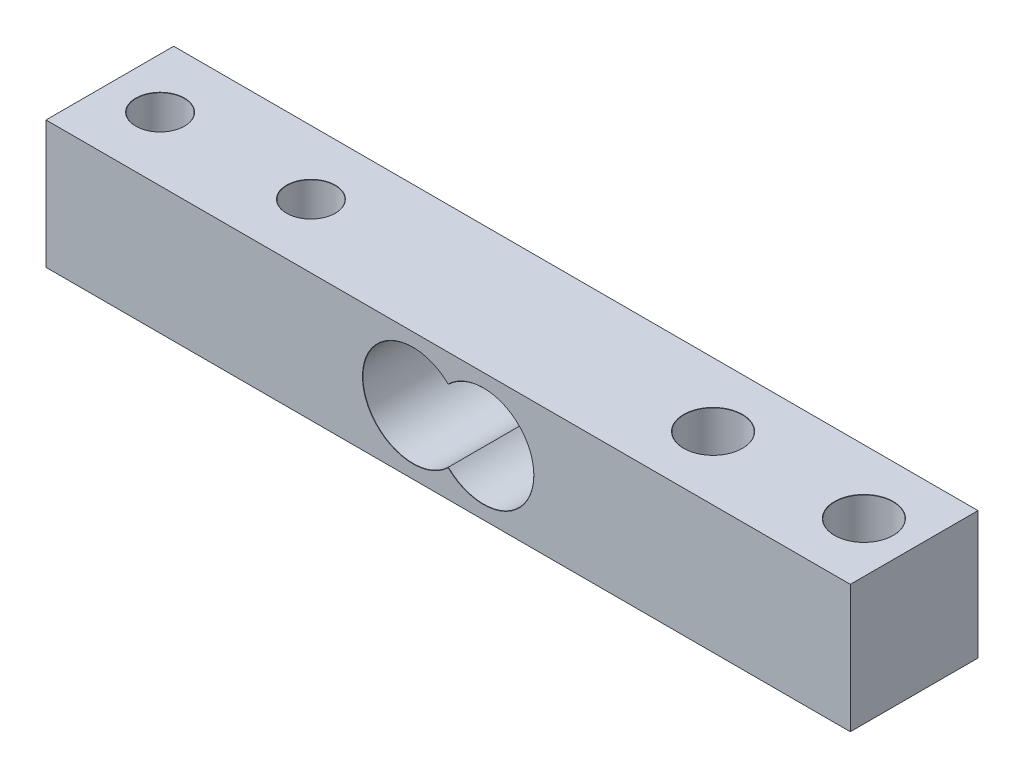
ISO-10303-21;
HEADER;
FILE_DESCRIPTION(('STEP AP214'),'2;1');
FILE_NAME('part.step','',(''),(''),'','','');
FILE_SCHEMA(('AUTOMOTIVE_DESIGN { 1 0 10303 214 1 1 1 1 }'));
ENDSEC;
DATA;
#1=APPLICATION_CONTEXT('core data for automotive mechanical design processes');
#2=APPLICATION_PROTOCOL_DEFINITION('international standard','automotive_design',2000,#1);
#3=PRODUCT_CONTEXT('',#1,'mechanical');
#4=PRODUCT('Part','Part','',(#3));
#5=PRODUCT_RELATED_PRODUCT_CATEGORY('part','',(#4));
#6=PRODUCT_DEFINITION_FORMATION('','',#4);
#7=PRODUCT_DEFINITION_CONTEXT('part definition',#1,'design');
#8=PRODUCT_DEFINITION('design','',#6,#7);
#9=PRODUCT_DEFINITION_SHAPE('','',#8);
#10=(LENGTH_UNIT() NAMED_UNIT(*) SI_UNIT(.MILLI.,.METRE.));
#11=(NAMED_UNIT(*) PLANE_ANGLE_UNIT() SI_UNIT($,.RADIAN.));
#12=(NAMED_UNIT(*) SI_UNIT($,.STERADIAN.) SOLID_ANGLE_UNIT());
#13=UNCERTAINTY_MEASURE_WITH_UNIT(LENGTH_MEASURE(1.E-05),#10,'distance_accuracy_value','');
#14=(GEOMETRIC_REPRESENTATION_CONTEXT(3) GLOBAL_UNCERTAINTY_ASSIGNED_CONTEXT((#13)) GLOBAL_UNIT_ASSIGNED_CONTEXT((#10,
#11,#12)) REPRESENTATION_CONTEXT('',''));
#15=CARTESIAN_POINT('',(0.,0.,0.));
#16=DIRECTION('',(0.,0.,1.));
#17=DIRECTION('',(1.,0.,0.));
#18=AXIS2_PLACEMENT_3D('',#15,#16,#17);
#19=CARTESIAN_POINT('',(40.,12.7,6.35));
#20=DIRECTION('',(-1.,0.,0.));
#21=DIRECTION('',(0.,0.,1.));
#22=AXIS2_PLACEMENT_3D('',#19,#20,#21);
#23=PLANE('',#22);
#24=DIRECTION('',(0.,0.,-1.));
#25=VECTOR('',#24,1.);
#26=CARTESIAN_POINT('',(40.,0.,6.35));
#27=LINE('',#26,#25);
#28=CARTESIAN_POINT('',(40.,0.,6.35));
#29=VERTEX_POINT('',#28);
#30=CARTESIAN_POINT('',(40.,0.,-6.35));
#31=VERTEX_POINT('',#30);
#32=EDGE_CURVE('E158',#29,#31,#27,.T.);
#33=ORIENTED_EDGE('',*,*,#32,.T.);
#34=DIRECTION('',(0.,-1.,0.));
#35=VECTOR('',#34,1.);
#36=CARTESIAN_POINT('',(40.,12.7,-6.35));
#37=LINE('',#36,#35);
#38=CARTESIAN_POINT('',(40.,12.7,-6.35));
#39=VERTEX_POINT('',#38);
#40=EDGE_CURVE('E179',#39,#31,#37,.T.);
#41=ORIENTED_EDGE('',*,*,#40,.F.);
#42=DIRECTION('',(0.,0.,-1.));
#43=VECTOR('',#42,1.);
#44=CARTESIAN_POINT('',(40.,12.7,6.35));
#45=LINE('',#44,#43);
#46=CARTESIAN_POINT('',(40.,12.7,6.35));
#47=VERTEX_POINT('',#46);
#48=EDGE_CURVE('E159',#47,#39,#45,.T.);
#49=ORIENTED_EDGE('',*,*,#48,.F.);
#50=DIRECTION('',(0.,-1.,0.));
#51=VECTOR('',#50,1.);
#52=CARTESIAN_POINT('',(40.,12.7,6.35));
#53=LINE('',#52,#51);
#54=EDGE_CURVE('E165',#47,#29,#53,.T.);
#55=ORIENTED_EDGE('',*,*,#54,.T.);
#56=EDGE_LOOP('',(#33,#41,#49,#55));
#57=FACE_BOUND('',#56,.T.);
#58=ADVANCED_FACE('F43',(#57),#23,.F.);
#59=CARTESIAN_POINT('',(-40.,12.7,-6.35));
#60=DIRECTION('',(0.,0.,1.));
#61=DIRECTION('',(1.,0.,0.));
#62=AXIS2_PLACEMENT_3D('',#59,#60,#61);
#63=PLANE('',#62);
#64=CARTESIAN_POINT('',(3.5,6.35,-6.35));
#65=DIRECTION('',(0.,0.,1.));
#66=DIRECTION('',(1.,0.,0.));
#67=AXIS2_PLACEMENT_3D('',#64,#65,#66);
#68=CIRCLE('',#67,5.);
#69=CARTESIAN_POINT('',(0.,2.77928578572858,-6.35));
#70=VERTEX_POINT('',#69);
#71=CARTESIAN_POINT('',(0.,9.92071421427142,-6.35));
#72=VERTEX_POINT('',#71);
#73=EDGE_CURVE('E134',#70,#72,#68,.T.);
#74=ORIENTED_EDGE('',*,*,#73,.T.);
#75=CARTESIAN_POINT('',(-3.5,6.35,-6.35));
#76=DIRECTION('',(0.,0.,1.));
#77=DIRECTION('',(1.,0.,0.));
#78=AXIS2_PLACEMENT_3D('',#75,#76,#77);
#79=CIRCLE('',#78,5.);
#80=EDGE_CURVE('E115',#72,#70,#79,.T.);
#81=ORIENTED_EDGE('',*,*,#80,.T.);
#82=EDGE_LOOP('',(#74,#81));
#83=FACE_BOUND('',#82,.T.);
#84=DIRECTION('',(-1.,0.,0.));
#85=VECTOR('',#84,1.);
#86=CARTESIAN_POINT('',(-40.,0.,-6.35));
#87=LINE('',#86,#85);
#88=CARTESIAN_POINT('',(-40.,0.,-6.35));
#89=VERTEX_POINT('',#88);
#90=EDGE_CURVE('E168',#31,#89,#87,.T.);
#91=ORIENTED_EDGE('',*,*,#90,.T.);
#92=DIRECTION('',(0.,-1.,0.));
#93=VECTOR('',#92,1.);
#94=CARTESIAN_POINT('',(-40.,12.7,-6.35));
#95=LINE('',#94,#93);
#96=CARTESIAN_POINT('',(-40.,12.7,-6.35));
#97=VERTEX_POINT('',#96);
#98=EDGE_CURVE('E176',#97,#89,#95,.T.);
#99=ORIENTED_EDGE('',*,*,#98,.F.);
#100=DIRECTION('',(-1.,0.,0.));
#101=VECTOR('',#100,1.);
#102=CARTESIAN_POINT('',(-40.,12.7,-6.35));
#103=LINE('',#102,#101);
#104=EDGE_CURVE('E95',#39,#97,#103,.T.);
#105=ORIENTED_EDGE('',*,*,#104,.F.);
#106=ORIENTED_EDGE('',*,*,#40,.T.);
#107=EDGE_LOOP('',(#91,#99,#105,#106));
#108=FACE_BOUND('',#107,.T.);
#109=ADVANCED_FACE('F205',(#83,#108),#63,.F.);
#110=CARTESIAN_POINT('',(-40.,12.7,6.35));
#111=DIRECTION('',(1.,0.,0.));
#112=DIRECTION('',(0.,0.,-1.));
#113=AXIS2_PLACEMENT_3D('',#110,#111,#112);
#114=PLANE('',#113);
#115=DIRECTION('',(0.,0.,1.));
#116=VECTOR('',#115,1.);
#117=CARTESIAN_POINT('',(-40.,0.,6.35));
#118=LINE('',#117,#116);
#119=CARTESIAN_POINT('',(-40.,0.,6.35));
#120=VERTEX_POINT('',#119);
#121=EDGE_CURVE('E170',#89,#120,#118,.T.);
#122=ORIENTED_EDGE('',*,*,#121,.T.);
#123=DIRECTION('',(0.,-1.,0.));
#124=VECTOR('',#123,1.);
#125=CARTESIAN_POINT('',(-40.,12.7,6.35));
#126=LINE('',#125,#124);
#127=CARTESIAN_POINT('',(-40.,12.7,6.35));
#128=VERTEX_POINT('',#127);
#129=EDGE_CURVE('E174',#128,#120,#126,.T.);
#130=ORIENTED_EDGE('',*,*,#129,.F.);
#131=DIRECTION('',(0.,0.,1.));
#132=VECTOR('',#131,1.);
#133=CARTESIAN_POINT('',(-40.,12.7,6.35));
#134=LINE('',#133,#132);
#135=EDGE_CURVE('E162',#97,#128,#134,.T.);
#136=ORIENTED_EDGE('',*,*,#135,.F.);
#137=ORIENTED_EDGE('',*,*,#98,.T.);
#138=EDGE_LOOP('',(#122,#130,#136,#137));
#139=FACE_BOUND('',#138,.T.);
#140=ADVANCED_FACE('F211',(#139),#114,.F.);
#141=CARTESIAN_POINT('',(-40.,12.7,6.35));
#142=DIRECTION('',(0.,0.,-1.));
#143=DIRECTION('',(-1.,0.,0.));
#144=AXIS2_PLACEMENT_3D('',#141,#142,#143);
#145=PLANE('',#144);
#146=CARTESIAN_POINT('',(3.5,6.35,6.35));
#147=DIRECTION('',(0.,0.,1.));
#148=DIRECTION('',(1.,0.,0.));
#149=AXIS2_PLACEMENT_3D('',#146,#147,#148);
#150=CIRCLE('',#149,5.025);
#151=CARTESIAN_POINT('',(0.,2.74436205367205,6.35));
#152=VERTEX_POINT('',#151);
#153=CARTESIAN_POINT('',(0.,9.95563794632795,6.35));
#154=VERTEX_POINT('',#153);
#155=EDGE_CURVE('E131',#152,#154,#150,.T.);
#156=ORIENTED_EDGE('',*,*,#155,.F.);
#157=CARTESIAN_POINT('',(-3.5,6.35,6.35));
#158=DIRECTION('',(0.,0.,1.));
#159=DIRECTION('',(1.,0.,0.));
#160=AXIS2_PLACEMENT_3D('',#157,#158,#159);
#161=CIRCLE('',#160,5.025);
#162=EDGE_CURVE('E57',#154,#152,#161,.T.);
#163=ORIENTED_EDGE('',*,*,#162,.F.);
#164=EDGE_LOOP('',(#156,#163));
#165=FACE_BOUND('',#164,.T.);
#166=DIRECTION('',(1.,0.,0.));
#167=VECTOR('',#166,1.);
#168=CARTESIAN_POINT('',(-40.,0.,6.35));
#169=LINE('',#168,#167);
#170=EDGE_CURVE('E87',#120,#29,#169,.T.);
#171=ORIENTED_EDGE('',*,*,#170,.T.);
#172=ORIENTED_EDGE('',*,*,#54,.F.);
#173=DIRECTION('',(1.,0.,0.));
#174=VECTOR('',#173,1.);
#175=CARTESIAN_POINT('',(-40.,12.7,6.35));
#176=LINE('',#175,#174);
#177=EDGE_CURVE('E66',#128,#47,#176,.T.);
#178=ORIENTED_EDGE('',*,*,#177,.F.);
#179=ORIENTED_EDGE('',*,*,#129,.T.);
#180=EDGE_LOOP('',(#171,#172,#178,#179));
#181=FACE_BOUND('',#180,.T.);
#182=ADVANCED_FACE('F224',(#165,#181),#145,.F.);
#183=CARTESIAN_POINT('',(0.,12.7,0.));
#184=DIRECTION('',(0.,-1.,0.));
#185=DIRECTION('',(0.,0.,-1.));
#186=AXIS2_PLACEMENT_3D('',#183,#184,#185);
#187=PLANE('',#186);
#188=CARTESIAN_POINT('',(35.,12.7,0.));
#189=DIRECTION('',(0.,1.,0.));
#190=DIRECTION('',(0.,0.,1.));
#191=AXIS2_PLACEMENT_3D('',#188,#189,#190);
#192=CIRCLE('',#191,2.925);
#193=CARTESIAN_POINT('',(35.,12.7,2.925));
#194=VERTEX_POINT('',#193);
#195=EDGE_CURVE('E354',#194,#194,#192,.T.);
#196=ORIENTED_EDGE('',*,*,#195,.F.);
#197=EDGE_LOOP('',(#196));
#198=FACE_BOUND('',#197,.T.);
#199=CARTESIAN_POINT('',(20.,12.7,0.));
#200=DIRECTION('',(0.,1.,0.));
#201=DIRECTION('',(0.,0.,1.));
#202=AXIS2_PLACEMENT_3D('',#199,#200,#201);
#203=CIRCLE('',#202,2.925);
#204=CARTESIAN_POINT('',(20.,12.7,2.92499999999999));
#205=VERTEX_POINT('',#204);
#206=EDGE_CURVE('E361',#205,#205,#203,.T.);
#207=ORIENTED_EDGE('',*,*,#206,.F.);
#208=EDGE_LOOP('',(#207));
#209=FACE_BOUND('',#208,.T.);
#210=CARTESIAN_POINT('',(-35.,12.7,0.));
#211=DIRECTION('',(0.,1.,0.));
#212=DIRECTION('',(0.,0.,1.));
#213=AXIS2_PLACEMENT_3D('',#210,#211,#212);
#214=CIRCLE('',#213,2.425);
#215=CARTESIAN_POINT('',(-35.,12.7,2.425));
#216=VERTEX_POINT('',#215);
#217=EDGE_CURVE('E136',#216,#216,#214,.T.);
#218=ORIENTED_EDGE('',*,*,#217,.F.);
#219=EDGE_LOOP('',(#218));
#220=FACE_BOUND('',#219,.T.);
#221=CARTESIAN_POINT('',(-20.,12.7,0.));
#222=DIRECTION('',(0.,1.,0.));
#223=DIRECTION('',(0.,0.,1.));
#224=AXIS2_PLACEMENT_3D('',#221,#222,#223);
#225=CIRCLE('',#224,2.425);
#226=CARTESIAN_POINT('',(-20.,12.7,2.425));
#227=VERTEX_POINT('',#226);
#228=EDGE_CURVE('E149',#227,#227,#225,.T.);
#229=ORIENTED_EDGE('',*,*,#228,.F.);
#230=EDGE_LOOP('',(#229));
#231=FACE_BOUND('',#230,.T.);
#232=ORIENTED_EDGE('',*,*,#48,.T.);
#233=ORIENTED_EDGE('',*,*,#104,.T.);
#234=ORIENTED_EDGE('',*,*,#135,.T.);
#235=ORIENTED_EDGE('',*,*,#177,.T.);
#236=EDGE_LOOP('',(#232,#233,#234,#235));
#237=FACE_BOUND('',#236,.T.);
#238=ADVANCED_FACE('F222',(#198,#209,#220,#231,#237),#187,.F.);
#239=CARTESIAN_POINT('',(0.,0.,0.));
#240=DIRECTION('',(0.,-1.,0.));
#241=DIRECTION('',(0.,0.,-1.));
#242=AXIS2_PLACEMENT_3D('',#239,#240,#241);
#243=PLANE('',#242);
#244=CARTESIAN_POINT('',(35.,0.,0.));
#245=DIRECTION('',(0.,1.,0.));
#246=DIRECTION('',(0.,0.,1.));
#247=AXIS2_PLACEMENT_3D('',#244,#245,#246);
#248=CIRCLE('',#247,2.9);
#249=CARTESIAN_POINT('',(35.,0.,2.9));
#250=VERTEX_POINT('',#249);
#251=EDGE_CURVE('E356',#250,#250,#248,.T.);
#252=ORIENTED_EDGE('',*,*,#251,.T.);
#253=EDGE_LOOP('',(#252));
#254=FACE_BOUND('',#253,.T.);
#255=CARTESIAN_POINT('',(20.,0.,0.));
#256=DIRECTION('',(0.,1.,0.));
#257=DIRECTION('',(0.,0.,1.));
#258=AXIS2_PLACEMENT_3D('',#255,#256,#257);
#259=CIRCLE('',#258,2.9);
#260=CARTESIAN_POINT('',(20.,0.,2.89999999999999));
#261=VERTEX_POINT('',#260);
#262=EDGE_CURVE('E367',#261,#261,#259,.T.);
#263=ORIENTED_EDGE('',*,*,#262,.T.);
#264=EDGE_LOOP('',(#263));
#265=FACE_BOUND('',#264,.T.);
#266=CARTESIAN_POINT('',(-35.,0.,0.));
#267=DIRECTION('',(0.,1.,0.));
#268=DIRECTION('',(0.,0.,1.));
#269=AXIS2_PLACEMENT_3D('',#266,#267,#268);
#270=CIRCLE('',#269,2.4);
#271=CARTESIAN_POINT('',(-35.,0.,2.4));
#272=VERTEX_POINT('',#271);
#273=EDGE_CURVE('E146',#272,#272,#270,.T.);
#274=ORIENTED_EDGE('',*,*,#273,.T.);
#275=EDGE_LOOP('',(#274));
#276=FACE_BOUND('',#275,.T.);
#277=CARTESIAN_POINT('',(-20.,0.,0.));
#278=DIRECTION('',(0.,1.,0.));
#279=DIRECTION('',(0.,0.,1.));
#280=AXIS2_PLACEMENT_3D('',#277,#278,#279);
#281=CIRCLE('',#280,2.4);
#282=CARTESIAN_POINT('',(-20.,0.,2.4));
#283=VERTEX_POINT('',#282);
#284=EDGE_CURVE('E155',#283,#283,#281,.T.);
#285=ORIENTED_EDGE('',*,*,#284,.T.);
#286=EDGE_LOOP('',(#285));
#287=FACE_BOUND('',#286,.T.);
#288=ORIENTED_EDGE('',*,*,#32,.F.);
#289=ORIENTED_EDGE('',*,*,#170,.F.);
#290=ORIENTED_EDGE('',*,*,#121,.F.);
#291=ORIENTED_EDGE('',*,*,#90,.F.);
#292=EDGE_LOOP('',(#288,#289,#290,#291));
#293=FACE_BOUND('',#292,.T.);
#294=ADVANCED_FACE('F217',(#254,#265,#276,#287,#293),#243,.T.);
#295=CARTESIAN_POINT('',(-20.,12.7,0.));
#296=DIRECTION('',(0.,1.,0.));
#297=DIRECTION('',(0.,0.,1.));
#298=AXIS2_PLACEMENT_3D('',#295,#296,#297);
#299=CYLINDRICAL_SURFACE('',#298,2.4);
#300=ORIENTED_EDGE('',*,*,#284,.F.);
#301=EDGE_LOOP('',(#300));
#302=FACE_BOUND('',#301,.T.);
#303=CARTESIAN_POINT('',(-20.,12.6790225092206,0.));
#304=DIRECTION('',(0.,1.,0.));
#305=DIRECTION('',(0.,0.,1.));
#306=AXIS2_PLACEMENT_3D('',#303,#304,#305);
#307=CIRCLE('',#306,2.4);
#308=CARTESIAN_POINT('',(-20.,12.6790225092206,2.4));
#309=VERTEX_POINT('',#308);
#310=EDGE_CURVE('E152',#309,#309,#307,.T.);
#311=ORIENTED_EDGE('',*,*,#310,.T.);
#312=EDGE_LOOP('',(#311));
#313=FACE_BOUND('',#312,.T.);
#314=ADVANCED_FACE('F230',(#302,#313),#299,.F.);
#315=CARTESIAN_POINT('',(-20.,12.7,0.));
#316=DIRECTION('',(0.,1.,0.));
#317=DIRECTION('',(0.,0.,1.));
#318=AXIS2_PLACEMENT_3D('',#315,#316,#317);
#319=CONICAL_SURFACE('',#318,2.425,0.872664625997118);
#320=ORIENTED_EDGE('',*,*,#310,.F.);
#321=EDGE_LOOP('',(#320));
#322=FACE_BOUND('',#321,.T.);
#323=ORIENTED_EDGE('',*,*,#228,.T.);
#324=EDGE_LOOP('',(#323));
#325=FACE_BOUND('',#324,.T.);
#326=ADVANCED_FACE('F252',(#322,#325),#319,.F.);
#327=CARTESIAN_POINT('',(-35.,12.7,0.));
#328=DIRECTION('',(0.,1.,0.));
#329=DIRECTION('',(0.,0.,1.));
#330=AXIS2_PLACEMENT_3D('',#327,#328,#329);
#331=CYLINDRICAL_SURFACE('',#330,2.4);
#332=ORIENTED_EDGE('',*,*,#273,.F.);
#333=EDGE_LOOP('',(#332));
#334=FACE_BOUND('',#333,.T.);
#335=CARTESIAN_POINT('',(-35.,12.6790225092206,0.));
#336=DIRECTION('',(0.,1.,0.));
#337=DIRECTION('',(0.,0.,1.));
#338=AXIS2_PLACEMENT_3D('',#335,#336,#337);
#339=CIRCLE('',#338,2.4);
#340=CARTESIAN_POINT('',(-35.,12.6790225092206,2.4));
#341=VERTEX_POINT('',#340);
#342=EDGE_CURVE('E143',#341,#341,#339,.T.);
#343=ORIENTED_EDGE('',*,*,#342,.T.);
#344=EDGE_LOOP('',(#343));
#345=FACE_BOUND('',#344,.T.);
#346=ADVANCED_FACE('F261',(#334,#345),#331,.F.);
#347=CARTESIAN_POINT('',(-35.,12.7,0.));
#348=DIRECTION('',(0.,1.,0.));
#349=DIRECTION('',(0.,0.,1.));
#350=AXIS2_PLACEMENT_3D('',#347,#348,#349);
#351=CONICAL_SURFACE('',#350,2.425,0.87266462599705);
#352=ORIENTED_EDGE('',*,*,#342,.F.);
#353=EDGE_LOOP('',(#352));
#354=FACE_BOUND('',#353,.T.);
#355=ORIENTED_EDGE('',*,*,#217,.T.);
#356=EDGE_LOOP('',(#355));
#357=FACE_BOUND('',#356,.T.);
#358=ADVANCED_FACE('F269',(#354,#357),#351,.F.);
#359=CARTESIAN_POINT('',(3.5,6.35,6.35));
#360=DIRECTION('',(0.,0.,1.));
#361=DIRECTION('',(1.,0.,0.));
#362=AXIS2_PLACEMENT_3D('',#359,#360,#361);
#363=CYLINDRICAL_SURFACE('',#362,5.);
#364=ORIENTED_EDGE('',*,*,#73,.F.);
#365=DIRECTION('',(0.,0.,1.));
#366=VECTOR('',#365,1.);
#367=CARTESIAN_POINT('',(0.,2.77928578572858,-0.0104887453897182));
#368=LINE('',#367,#366);
#369=CARTESIAN_POINT('',(0.,2.77928578572858,6.32902250922056));
#370=VERTEX_POINT('',#369);
#371=EDGE_CURVE('E11',#70,#370,#368,.T.);
#372=ORIENTED_EDGE('',*,*,#371,.T.);
#373=CARTESIAN_POINT('',(3.5,6.35,6.32902250922056));
#374=DIRECTION('',(0.,0.,1.));
#375=DIRECTION('',(1.,0.,0.));
#376=AXIS2_PLACEMENT_3D('',#373,#374,#375);
#377=CIRCLE('',#376,5.);
#378=CARTESIAN_POINT('',(0.,9.92071421427142,6.32902250922056));
#379=VERTEX_POINT('',#378);
#380=EDGE_CURVE('E129',#370,#379,#377,.T.);
#381=ORIENTED_EDGE('',*,*,#380,.T.);
#382=DIRECTION('',(0.,0.,1.));
#383=VECTOR('',#382,1.);
#384=CARTESIAN_POINT('',(0.,9.92071421427142,-0.0104887453897182));
#385=LINE('',#384,#383);
#386=EDGE_CURVE('E50',#379,#72,#385,.F.);
#387=ORIENTED_EDGE('',*,*,#386,.T.);
#388=EDGE_LOOP('',(#364,#372,#381,#387));
#389=FACE_BOUND('',#388,.T.);
#390=ADVANCED_FACE('F133',(#389),#363,.F.);
#391=CARTESIAN_POINT('',(3.5,6.35,6.35));
#392=DIRECTION('',(0.,0.,1.));
#393=DIRECTION('',(1.,0.,0.));
#394=AXIS2_PLACEMENT_3D('',#391,#392,#393);
#395=CONICAL_SURFACE('',#394,5.025,0.872664625997152);
#396=ORIENTED_EDGE('',*,*,#155,.T.);
#397=CARTESIAN_POINT('',(0.,9.95597011656117,6.3502));
#398=CARTESIAN_POINT('',(0.,9.95004230803107,6.34663075398195));
#399=CARTESIAN_POINT('',(0.,9.94411259812668,6.34306467340926));
#400=CARTESIAN_POINT('',(0.,9.93224937556076,6.33593884314944));
#401=CARTESIAN_POINT('',(0.,9.92631586289921,6.33237909346232));
#402=CARTESIAN_POINT('',(0.,9.92038044886338,6.32882250922057));
#403=B_SPLINE_CURVE_WITH_KNOTS('',3,(#397,#398,#399,#400,#401,#402),.UNSPECIFIED.,.F.,.F.,(4,2,
4),(0.,0.0207582636993012,0.0415165274286483),.UNSPECIFIED.);
#404=EDGE_CURVE('E120',#154,#379,#403,.T.);
#405=ORIENTED_EDGE('',*,*,#404,.T.);
#406=ORIENTED_EDGE('',*,*,#380,.F.);
#407=CARTESIAN_POINT('',(0.,2.77961955113662,6.32882250922056));
#408=CARTESIAN_POINT('',(0.,2.77368413710079,6.33237909346232));
#409=CARTESIAN_POINT('',(0.,2.76775062443924,6.33593884314944));
#410=CARTESIAN_POINT('',(0.,2.75588740187332,6.34306467340926));
#411=CARTESIAN_POINT('',(0.,2.74995769196893,6.34663075398195));
#412=CARTESIAN_POINT('',(0.,2.74402988343883,6.3502));
#413=B_SPLINE_CURVE_WITH_KNOTS('',3,(#407,#408,#409,#410,#411,#412),.UNSPECIFIED.,.F.,.F.,(4,2,
4),(0.,0.0207582637293475,0.0415165274286479),.UNSPECIFIED.);
#414=EDGE_CURVE('E123',#370,#152,#413,.T.);
#415=ORIENTED_EDGE('',*,*,#414,.T.);
#416=EDGE_LOOP('',(#396,#405,#406,#415));
#417=FACE_BOUND('',#416,.T.);
#418=ADVANCED_FACE('F128',(#417),#395,.F.);
#419=CARTESIAN_POINT('',(-3.5,6.35,6.35));
#420=DIRECTION('',(0.,0.,1.));
#421=DIRECTION('',(1.,0.,0.));
#422=AXIS2_PLACEMENT_3D('',#419,#420,#421);
#423=CYLINDRICAL_SURFACE('',#422,5.);
#424=ORIENTED_EDGE('',*,*,#80,.F.);
#425=ORIENTED_EDGE('',*,*,#386,.F.);
#426=CARTESIAN_POINT('',(-3.5,6.35,6.32902250922056));
#427=DIRECTION('',(0.,0.,1.));
#428=DIRECTION('',(1.,0.,0.));
#429=AXIS2_PLACEMENT_3D('',#426,#427,#428);
#430=CIRCLE('',#429,5.);
#431=EDGE_CURVE('E113',#379,#370,#430,.T.);
#432=ORIENTED_EDGE('',*,*,#431,.T.);
#433=ORIENTED_EDGE('',*,*,#371,.F.);
#434=EDGE_LOOP('',(#424,#425,#432,#433));
#435=FACE_BOUND('',#434,.T.);
#436=ADVANCED_FACE('F112',(#435),#423,.F.);
#437=CARTESIAN_POINT('',(-3.5,6.35,6.35));
#438=DIRECTION('',(0.,0.,1.));
#439=DIRECTION('',(1.,0.,0.));
#440=AXIS2_PLACEMENT_3D('',#437,#438,#439);
#441=CONICAL_SURFACE('',#440,5.025,0.872664625997152);
#442=ORIENTED_EDGE('',*,*,#162,.T.);
#443=ORIENTED_EDGE('',*,*,#414,.F.);
#444=ORIENTED_EDGE('',*,*,#431,.F.);
#445=ORIENTED_EDGE('',*,*,#404,.F.);
#446=EDGE_LOOP('',(#442,#443,#444,#445));
#447=FACE_BOUND('',#446,.T.);
#448=ADVANCED_FACE('F122',(#447),#441,.F.);
#449=CARTESIAN_POINT('',(20.,12.7,0.));
#450=DIRECTION('',(0.,1.,0.));
#451=DIRECTION('',(0.,0.,1.));
#452=AXIS2_PLACEMENT_3D('',#449,#450,#451);
#453=CYLINDRICAL_SURFACE('',#452,2.9);
#454=ORIENTED_EDGE('',*,*,#262,.F.);
#455=EDGE_LOOP('',(#454));
#456=FACE_BOUND('',#455,.T.);
#457=CARTESIAN_POINT('',(20.,12.6790225092206,0.));
#458=DIRECTION('',(0.,1.,0.));
#459=DIRECTION('',(0.,0.,1.));
#460=AXIS2_PLACEMENT_3D('',#457,#458,#459);
#461=CIRCLE('',#460,2.9);
#462=CARTESIAN_POINT('',(20.,12.6790225092206,2.89999999999999));
#463=VERTEX_POINT('',#462);
#464=EDGE_CURVE('E364',#463,#463,#461,.T.);
#465=ORIENTED_EDGE('',*,*,#464,.T.);
#466=EDGE_LOOP('',(#465));
#467=FACE_BOUND('',#466,.T.);
#468=ADVANCED_FACE('F197',(#456,#467),#453,.F.);
#469=CARTESIAN_POINT('',(20.,12.7,0.));
#470=DIRECTION('',(0.,1.,0.));
#471=DIRECTION('',(0.,0.,1.));
#472=AXIS2_PLACEMENT_3D('',#469,#470,#471);
#473=CONICAL_SURFACE('',#472,2.925,0.872664625997077);
#474=ORIENTED_EDGE('',*,*,#464,.F.);
#475=EDGE_LOOP('',(#474));
#476=FACE_BOUND('',#475,.T.);
#477=ORIENTED_EDGE('',*,*,#206,.T.);
#478=EDGE_LOOP('',(#477));
#479=FACE_BOUND('',#478,.T.);
#480=ADVANCED_FACE('F318',(#476,#479),#473,.F.);
#481=CARTESIAN_POINT('',(35.,12.7,0.));
#482=DIRECTION('',(0.,1.,0.));
#483=DIRECTION('',(0.,0.,1.));
#484=AXIS2_PLACEMENT_3D('',#481,#482,#483);
#485=CYLINDRICAL_SURFACE('',#484,2.9);
#486=ORIENTED_EDGE('',*,*,#251,.F.);
#487=EDGE_LOOP('',(#486));
#488=FACE_BOUND('',#487,.T.);
#489=CARTESIAN_POINT('',(35.,12.6790225092206,0.));
#490=DIRECTION('',(0.,1.,0.));
#491=DIRECTION('',(0.,0.,1.));
#492=AXIS2_PLACEMENT_3D('',#489,#490,#491);
#493=CIRCLE('',#492,2.9);
#494=CARTESIAN_POINT('',(35.,12.6790225092206,2.9));
#495=VERTEX_POINT('',#494);
#496=EDGE_CURVE('E352',#495,#495,#493,.T.);
#497=ORIENTED_EDGE('',*,*,#496,.T.);
#498=EDGE_LOOP('',(#497));
#499=FACE_BOUND('',#498,.T.);
#500=ADVANCED_FACE('F327',(#488,#499),#485,.F.);
#501=CARTESIAN_POINT('',(35.,12.7,0.));
#502=DIRECTION('',(0.,1.,0.));
#503=DIRECTION('',(0.,0.,1.));
#504=AXIS2_PLACEMENT_3D('',#501,#502,#503);
#505=CONICAL_SURFACE('',#504,2.925,0.872664625997009);
#506=ORIENTED_EDGE('',*,*,#496,.F.);
#507=EDGE_LOOP('',(#506));
#508=FACE_BOUND('',#507,.T.);
#509=ORIENTED_EDGE('',*,*,#195,.T.);
#510=EDGE_LOOP('',(#509));
#511=FACE_BOUND('',#510,.T.);
#512=ADVANCED_FACE('F336',(#508,#511),#505,.F.);
#513=CLOSED_SHELL('',(#58,#109,#140,#182,#238,#294,#314,#326,#346,#358,#390,#418,#436,#448,#468,
#480,#500,#512));
#514=MANIFOLD_SOLID_BREP('B2',#513);
#515=ADVANCED_BREP_SHAPE_REPRESENTATION('',(#18,#514),#14);
#516=SHAPE_DEFINITION_REPRESENTATION(#9,#515);
ENDSEC;
END-ISO-10303-21;
